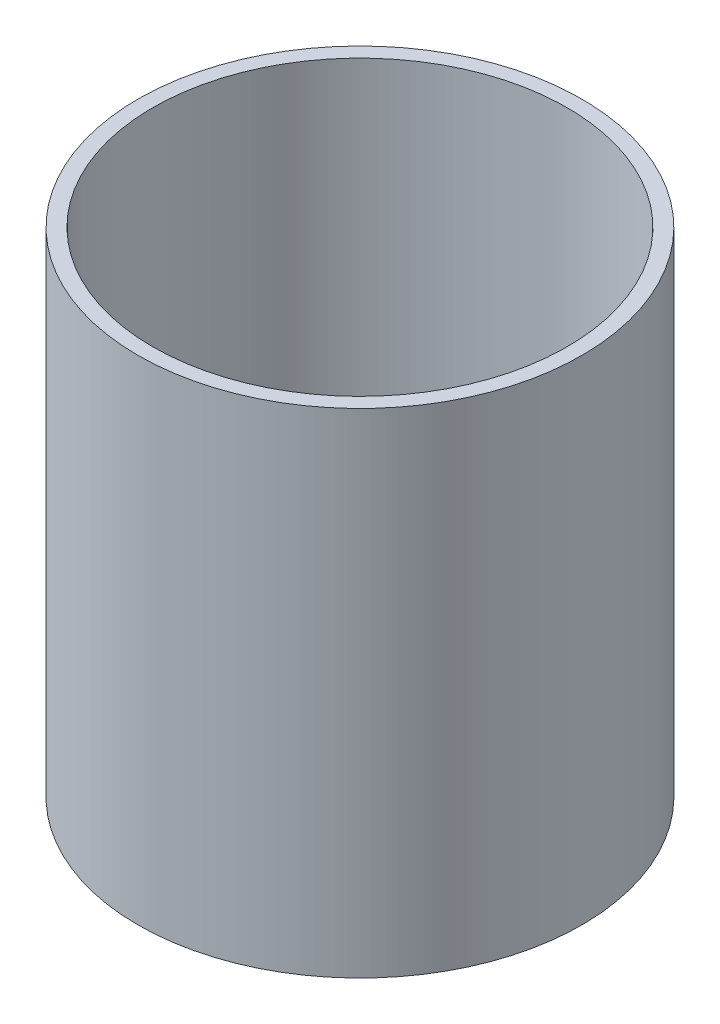
ISO-10303-21;
HEADER;
FILE_DESCRIPTION(('STEP AP214'),'2;1');
FILE_NAME('part.step','',(''),(''),'','','');
FILE_SCHEMA(('AUTOMOTIVE_DESIGN { 1 0 10303 214 1 1 1 1 }'));
ENDSEC;
DATA;
#1=APPLICATION_CONTEXT('core data for automotive mechanical design processes');
#2=APPLICATION_PROTOCOL_DEFINITION('international standard','automotive_design',2000,#1);
#3=PRODUCT_CONTEXT('',#1,'mechanical');
#4=PRODUCT('Part','Part','',(#3));
#5=PRODUCT_RELATED_PRODUCT_CATEGORY('part','',(#4));
#6=PRODUCT_DEFINITION_FORMATION('','',#4);
#7=PRODUCT_DEFINITION_CONTEXT('part definition',#1,'design');
#8=PRODUCT_DEFINITION('design','',#6,#7);
#9=PRODUCT_DEFINITION_SHAPE('','',#8);
#10=(LENGTH_UNIT() NAMED_UNIT(*) SI_UNIT(.MILLI.,.METRE.));
#11=(NAMED_UNIT(*) PLANE_ANGLE_UNIT() SI_UNIT($,.RADIAN.));
#12=(NAMED_UNIT(*) SI_UNIT($,.STERADIAN.) SOLID_ANGLE_UNIT());
#13=UNCERTAINTY_MEASURE_WITH_UNIT(LENGTH_MEASURE(1.E-05),#10,'distance_accuracy_value','');
#14=(GEOMETRIC_REPRESENTATION_CONTEXT(3) GLOBAL_UNCERTAINTY_ASSIGNED_CONTEXT((#13)) GLOBAL_UNIT_ASSIGNED_CONTEXT((#10,
#11,#12)) REPRESENTATION_CONTEXT('',''));
#15=CARTESIAN_POINT('',(0.,0.,0.));
#16=DIRECTION('',(0.,0.,1.));
#17=DIRECTION('',(1.,0.,0.));
#18=AXIS2_PLACEMENT_3D('',#15,#16,#17);
#19=CARTESIAN_POINT('',(0.,50.,0.));
#20=DIRECTION('',(0.,1.,0.));
#21=DIRECTION('',(0.,0.,1.));
#22=AXIS2_PLACEMENT_3D('',#19,#20,#21);
#23=PLANE('',#22);
#24=CARTESIAN_POINT('',(0.,50.,0.));
#25=DIRECTION('',(0.,1.,0.));
#26=DIRECTION('',(0.,0.,1.));
#27=AXIS2_PLACEMENT_3D('',#24,#25,#26);
#28=CIRCLE('',#27,22.5);
#29=CARTESIAN_POINT('',(0.,50.,22.5));
#30=VERTEX_POINT('',#29);
#31=EDGE_CURVE('E10',#30,#30,#28,.T.);
#32=ORIENTED_EDGE('',*,*,#31,.T.);
#33=EDGE_LOOP('',(#32));
#34=FACE_BOUND('',#33,.T.);
#35=CARTESIAN_POINT('',(0.,50.,0.));
#36=DIRECTION('',(0.,1.,0.));
#37=DIRECTION('',(0.,0.,1.));
#38=AXIS2_PLACEMENT_3D('',#35,#36,#37);
#39=CIRCLE('',#38,21.);
#40=CARTESIAN_POINT('',(0.,50.,21.));
#41=VERTEX_POINT('',#40);
#42=EDGE_CURVE('E50',#41,#41,#39,.T.);
#43=ORIENTED_EDGE('',*,*,#42,.F.);
#44=EDGE_LOOP('',(#43));
#45=FACE_BOUND('',#44,.T.);
#46=ADVANCED_FACE('F37',(#34,#45),#23,.T.);
#47=CARTESIAN_POINT('',(0.,0.,0.));
#48=DIRECTION('',(0.,1.,0.));
#49=DIRECTION('',(0.,0.,1.));
#50=AXIS2_PLACEMENT_3D('',#47,#48,#49);
#51=PLANE('',#50);
#52=CARTESIAN_POINT('',(0.,0.,0.));
#53=DIRECTION('',(0.,1.,0.));
#54=DIRECTION('',(0.,0.,1.));
#55=AXIS2_PLACEMENT_3D('',#52,#53,#54);
#56=CIRCLE('',#55,22.5);
#57=CARTESIAN_POINT('',(0.,0.,22.5));
#58=VERTEX_POINT('',#57);
#59=EDGE_CURVE('E41',#58,#58,#56,.T.);
#60=ORIENTED_EDGE('',*,*,#59,.F.);
#61=EDGE_LOOP('',(#60));
#62=FACE_BOUND('',#61,.T.);
#63=CARTESIAN_POINT('',(0.,0.,0.));
#64=DIRECTION('',(0.,1.,0.));
#65=DIRECTION('',(0.,0.,1.));
#66=AXIS2_PLACEMENT_3D('',#63,#64,#65);
#67=CIRCLE('',#66,21.);
#68=CARTESIAN_POINT('',(0.,0.,21.));
#69=VERTEX_POINT('',#68);
#70=EDGE_CURVE('E52',#69,#69,#67,.T.);
#71=ORIENTED_EDGE('',*,*,#70,.T.);
#72=EDGE_LOOP('',(#71));
#73=FACE_BOUND('',#72,.T.);
#74=ADVANCED_FACE('F64',(#62,#73),#51,.F.);
#75=CARTESIAN_POINT('',(0.,50.,0.));
#76=DIRECTION('',(0.,-1.,0.));
#77=DIRECTION('',(0.,0.,-1.));
#78=AXIS2_PLACEMENT_3D('',#75,#76,#77);
#79=CYLINDRICAL_SURFACE('',#78,22.5);
#80=ORIENTED_EDGE('',*,*,#31,.F.);
#81=EDGE_LOOP('',(#80));
#82=FACE_BOUND('',#81,.T.);
#83=ORIENTED_EDGE('',*,*,#59,.T.);
#84=EDGE_LOOP('',(#83));
#85=FACE_BOUND('',#84,.T.);
#86=ADVANCED_FACE('F39',(#82,#85),#79,.T.);
#87=CARTESIAN_POINT('',(0.,50.,0.));
#88=DIRECTION('',(0.,-1.,0.));
#89=DIRECTION('',(0.,0.,-1.));
#90=AXIS2_PLACEMENT_3D('',#87,#88,#89);
#91=CYLINDRICAL_SURFACE('',#90,21.);
#92=ORIENTED_EDGE('',*,*,#42,.T.);
#93=EDGE_LOOP('',(#92));
#94=FACE_BOUND('',#93,.T.);
#95=ORIENTED_EDGE('',*,*,#70,.F.);
#96=EDGE_LOOP('',(#95));
#97=FACE_BOUND('',#96,.T.);
#98=ADVANCED_FACE('F60',(#94,#97),#91,.F.);
#99=CLOSED_SHELL('',(#46,#74,#86,#98));
#100=MANIFOLD_SOLID_BREP('B2',#99);
#101=ADVANCED_BREP_SHAPE_REPRESENTATION('',(#18,#100),#14);
#102=SHAPE_DEFINITION_REPRESENTATION(#9,#101);
ENDSEC;
END-ISO-10303-21;
